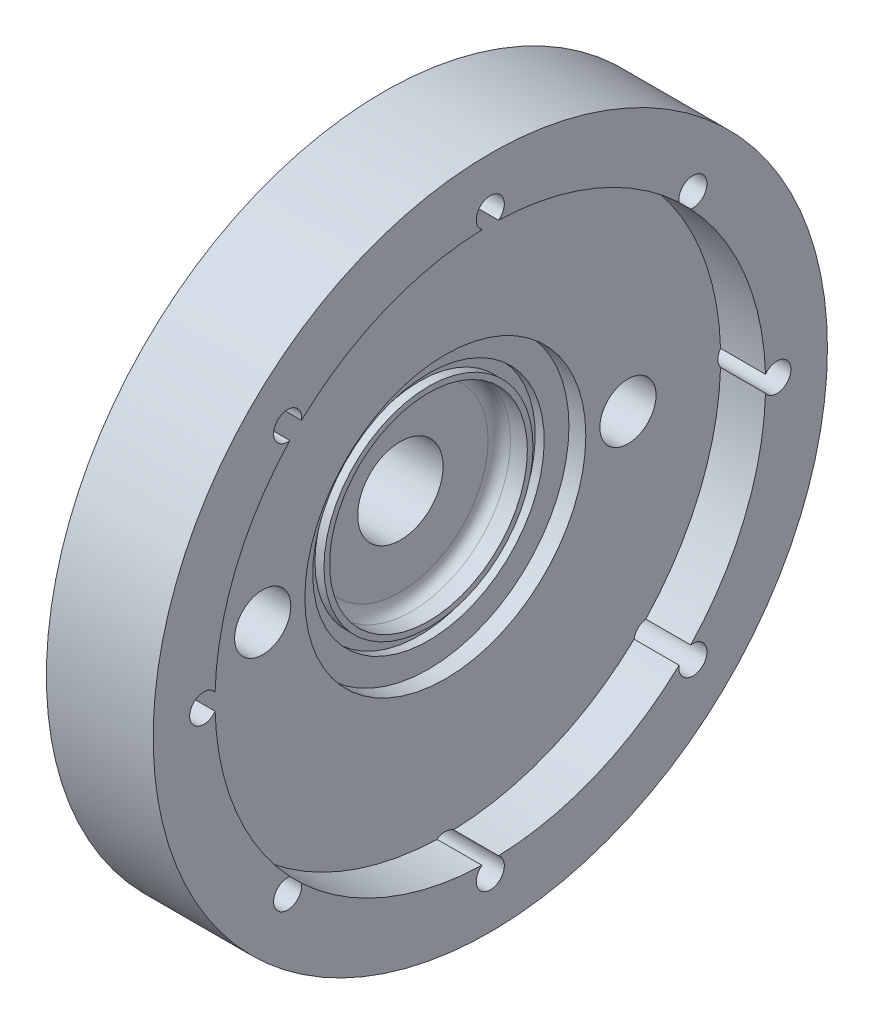
ISO-10303-21;
HEADER;
FILE_DESCRIPTION(('STEP AP214'),'2;1');
FILE_NAME('part.step','',(''),(''),'','','');
FILE_SCHEMA(('AUTOMOTIVE_DESIGN { 1 0 10303 214 1 1 1 1 }'));
ENDSEC;
DATA;
#1=APPLICATION_CONTEXT('core data for automotive mechanical design processes');
#2=APPLICATION_PROTOCOL_DEFINITION('international standard','automotive_design',2000,#1);
#3=PRODUCT_CONTEXT('',#1,'mechanical');
#4=PRODUCT('Part','Part','',(#3));
#5=PRODUCT_RELATED_PRODUCT_CATEGORY('part','',(#4));
#6=PRODUCT_DEFINITION_FORMATION('','',#4);
#7=PRODUCT_DEFINITION_CONTEXT('part definition',#1,'design');
#8=PRODUCT_DEFINITION('design','',#6,#7);
#9=PRODUCT_DEFINITION_SHAPE('','',#8);
#10=(LENGTH_UNIT() NAMED_UNIT(*) SI_UNIT(.MILLI.,.METRE.));
#11=(NAMED_UNIT(*) PLANE_ANGLE_UNIT() SI_UNIT($,.RADIAN.));
#12=(NAMED_UNIT(*) SI_UNIT($,.STERADIAN.) SOLID_ANGLE_UNIT());
#13=UNCERTAINTY_MEASURE_WITH_UNIT(LENGTH_MEASURE(1.E-05),#10,'distance_accuracy_value','');
#14=(GEOMETRIC_REPRESENTATION_CONTEXT(3) GLOBAL_UNCERTAINTY_ASSIGNED_CONTEXT((#13)) GLOBAL_UNIT_ASSIGNED_CONTEXT((#10,
#11,#12)) REPRESENTATION_CONTEXT('',''));
#15=CARTESIAN_POINT('',(0.,0.,0.));
#16=DIRECTION('',(0.,0.,1.));
#17=DIRECTION('',(1.,0.,0.));
#18=AXIS2_PLACEMENT_3D('',#15,#16,#17);
#19=CARTESIAN_POINT('',(13.97,0.,0.));
#20=DIRECTION('',(-1.,0.,0.));
#21=DIRECTION('',(0.,0.,1.));
#22=AXIS2_PLACEMENT_3D('',#19,#20,#21);
#23=CYLINDRICAL_SURFACE('',#22,62.23);
#24=DIRECTION('',(1.,0.,0.));
#25=VECTOR('',#24,1.);
#26=CARTESIAN_POINT('',(-8.89,62.2019852941176,-1.8670633278952));
#27=LINE('',#26,#25);
#28=CARTESIAN_POINT('',(3.81,62.2019852941176,-1.8670633278952));
#29=VERTEX_POINT('',#28);
#30=CARTESIAN_POINT('',(13.97,62.2019852941177,-1.86706332789523));
#31=VERTEX_POINT('',#30);
#32=EDGE_CURVE('E11',#29,#31,#27,.T.);
#33=ORIENTED_EDGE('',*,*,#32,.F.);
#34=CARTESIAN_POINT('',(3.81,0.,0.));
#35=DIRECTION('',(1.,0.,0.));
#36=DIRECTION('',(0.,0.,-1.));
#37=AXIS2_PLACEMENT_3D('',#34,#35,#36);
#38=CIRCLE('',#37,62.23);
#39=CARTESIAN_POINT('',(3.81,45.3036587447961,-42.6632324646768));
#40=VERTEX_POINT('',#39);
#41=EDGE_CURVE('E326',#29,#40,#38,.F.);
#42=ORIENTED_EDGE('',*,*,#41,.T.);
#43=DIRECTION('',(1.,0.,0.));
#44=VECTOR('',#43,1.);
#45=CARTESIAN_POINT('',(-8.89,45.3036587447961,-42.6632324646768));
#46=LINE('',#45,#44);
#47=CARTESIAN_POINT('',(13.97,45.3036587447962,-42.6632324646768));
#48=VERTEX_POINT('',#47);
#49=EDGE_CURVE('E160',#48,#40,#46,.F.);
#50=ORIENTED_EDGE('',*,*,#49,.F.);
#51=CARTESIAN_POINT('',(13.97,0.,0.));
#52=DIRECTION('',(1.,0.,0.));
#53=DIRECTION('',(0.,0.,-1.));
#54=AXIS2_PLACEMENT_3D('',#51,#52,#53);
#55=CIRCLE('',#54,62.23);
#56=EDGE_CURVE('E171',#48,#31,#55,.T.);
#57=ORIENTED_EDGE('',*,*,#56,.T.);
#58=EDGE_LOOP('',(#33,#42,#50,#57));
#59=FACE_BOUND('',#58,.T.);
#60=ADVANCED_FACE('F38',(#59),#23,.F.);
#61=DIRECTION('',(1.,0.,0.));
#62=VECTOR('',#61,1.);
#63=CARTESIAN_POINT('',(-8.89,62.2019852941176,1.86706332789564));
#64=LINE('',#63,#62);
#65=CARTESIAN_POINT('',(13.97,62.2019852941176,1.86706332789566));
#66=VERTEX_POINT('',#65);
#67=CARTESIAN_POINT('',(3.81,62.2019852941176,1.86706332789564));
#68=VERTEX_POINT('',#67);
#69=EDGE_CURVE('E46',#66,#68,#64,.F.);
#70=ORIENTED_EDGE('',*,*,#69,.F.);
#71=CARTESIAN_POINT('',(13.97,45.3036587447959,42.6632324646771));
#72=VERTEX_POINT('',#71);
#73=EDGE_CURVE('E184',#66,#72,#55,.T.);
#74=ORIENTED_EDGE('',*,*,#73,.T.);
#75=DIRECTION('',(1.,0.,0.));
#76=VECTOR('',#75,1.);
#77=CARTESIAN_POINT('',(-8.89,45.3036587447958,42.6632324646772));
#78=LINE('',#77,#76);
#79=CARTESIAN_POINT('',(3.81,45.3036587447958,42.6632324646772));
#80=VERTEX_POINT('',#79);
#81=EDGE_CURVE('E267',#80,#72,#78,.T.);
#82=ORIENTED_EDGE('',*,*,#81,.F.);
#83=EDGE_CURVE('E266',#80,#68,#38,.F.);
#84=ORIENTED_EDGE('',*,*,#83,.T.);
#85=EDGE_LOOP('',(#70,#74,#82,#84));
#86=FACE_BOUND('',#85,.T.);
#87=ADVANCED_FACE('F263',(#86),#23,.F.);
#88=DIRECTION('',(1.,0.,0.));
#89=VECTOR('',#88,1.);
#90=CARTESIAN_POINT('',(-8.89,42.6632324646767,45.3036587447963));
#91=LINE('',#90,#89);
#92=CARTESIAN_POINT('',(13.97,42.6632324646767,45.3036587447963));
#93=VERTEX_POINT('',#92);
#94=CARTESIAN_POINT('',(3.81,42.6632324646767,45.3036587447963));
#95=VERTEX_POINT('',#94);
#96=EDGE_CURVE('E314',#93,#95,#91,.F.);
#97=ORIENTED_EDGE('',*,*,#96,.F.);
#98=CARTESIAN_POINT('',(13.97,1.86706332789544,62.2019852941176));
#99=VERTEX_POINT('',#98);
#100=EDGE_CURVE('E270',#93,#99,#55,.T.);
#101=ORIENTED_EDGE('',*,*,#100,.T.);
#102=DIRECTION('',(1.,0.,0.));
#103=VECTOR('',#102,1.);
#104=CARTESIAN_POINT('',(-8.89,1.86706332789542,62.2019852941176));
#105=LINE('',#104,#103);
#106=CARTESIAN_POINT('',(3.81,1.86706332789541,62.2019852941176));
#107=VERTEX_POINT('',#106);
#108=EDGE_CURVE('E312',#107,#99,#105,.T.);
#109=ORIENTED_EDGE('',*,*,#108,.F.);
#110=EDGE_CURVE('E325',#107,#95,#38,.F.);
#111=ORIENTED_EDGE('',*,*,#110,.T.);
#112=EDGE_LOOP('',(#97,#101,#109,#111));
#113=FACE_BOUND('',#112,.T.);
#114=ADVANCED_FACE('F415',(#113),#23,.F.);
#115=DIRECTION('',(1.,0.,0.));
#116=VECTOR('',#115,1.);
#117=CARTESIAN_POINT('',(-8.89,-1.86706332789542,62.2019852941176));
#118=LINE('',#117,#116);
#119=CARTESIAN_POINT('',(13.97,-1.86706332789544,62.2019852941176));
#120=VERTEX_POINT('',#119);
#121=CARTESIAN_POINT('',(3.81,-1.86706332789546,62.2019852941176));
#122=VERTEX_POINT('',#121);
#123=EDGE_CURVE('E310',#120,#122,#118,.F.);
#124=ORIENTED_EDGE('',*,*,#123,.F.);
#125=CARTESIAN_POINT('',(13.97,-42.6632324646773,45.3036587447957));
#126=VERTEX_POINT('',#125);
#127=EDGE_CURVE('E272',#120,#126,#55,.T.);
#128=ORIENTED_EDGE('',*,*,#127,.T.);
#129=DIRECTION('',(1.,0.,0.));
#130=VECTOR('',#129,1.);
#131=CARTESIAN_POINT('',(-8.89,-42.6632324646773,45.3036587447957));
#132=LINE('',#131,#130);
#133=CARTESIAN_POINT('',(3.81,-42.6632324646773,45.3036587447957));
#134=VERTEX_POINT('',#133);
#135=EDGE_CURVE('E308',#134,#126,#132,.T.);
#136=ORIENTED_EDGE('',*,*,#135,.F.);
#137=EDGE_CURVE('E328',#134,#122,#38,.F.);
#138=ORIENTED_EDGE('',*,*,#137,.T.);
#139=EDGE_LOOP('',(#124,#128,#136,#138));
#140=FACE_BOUND('',#139,.T.);
#141=ADVANCED_FACE('F555',(#140),#23,.F.);
#142=DIRECTION('',(1.,0.,0.));
#143=VECTOR('',#142,1.);
#144=CARTESIAN_POINT('',(-8.89,-45.3036587447964,42.6632324646765));
#145=LINE('',#144,#143);
#146=CARTESIAN_POINT('',(13.97,-45.3036587447965,42.6632324646765));
#147=VERTEX_POINT('',#146);
#148=CARTESIAN_POINT('',(3.81,-45.3036587447964,42.6632324646765));
#149=VERTEX_POINT('',#148);
#150=EDGE_CURVE('E290',#147,#149,#145,.F.);
#151=ORIENTED_EDGE('',*,*,#150,.F.);
#152=CARTESIAN_POINT('',(13.97,-62.2019852941177,1.86706332789479));
#153=VERTEX_POINT('',#152);
#154=EDGE_CURVE('E193',#147,#153,#55,.T.);
#155=ORIENTED_EDGE('',*,*,#154,.T.);
#156=DIRECTION('',(1.,0.,0.));
#157=VECTOR('',#156,1.);
#158=CARTESIAN_POINT('',(-8.89,-62.2019852941177,1.86706332789477));
#159=LINE('',#158,#157);
#160=CARTESIAN_POINT('',(3.81,-62.2019852941177,1.86706332789476));
#161=VERTEX_POINT('',#160);
#162=EDGE_CURVE('E288',#161,#153,#159,.T.);
#163=ORIENTED_EDGE('',*,*,#162,.F.);
#164=EDGE_CURVE('E694',#161,#149,#38,.F.);
#165=ORIENTED_EDGE('',*,*,#164,.T.);
#166=EDGE_LOOP('',(#151,#155,#163,#165));
#167=FACE_BOUND('',#166,.T.);
#168=ADVANCED_FACE('F286',(#167),#23,.F.);
#169=DIRECTION('',(1.,0.,0.));
#170=VECTOR('',#169,1.);
#171=CARTESIAN_POINT('',(-8.89,-62.2019852941176,-1.86706332789607));
#172=LINE('',#171,#170);
#173=CARTESIAN_POINT('',(13.97,-62.2019852941176,-1.86706332789609));
#174=VERTEX_POINT('',#173);
#175=CARTESIAN_POINT('',(3.81,-62.2019852941176,-1.86706332789607));
#176=VERTEX_POINT('',#175);
#177=EDGE_CURVE('E299',#174,#176,#172,.F.);
#178=ORIENTED_EDGE('',*,*,#177,.F.);
#179=CARTESIAN_POINT('',(13.97,-45.3036587447956,-42.6632324646774));
#180=VERTEX_POINT('',#179);
#181=EDGE_CURVE('E186',#174,#180,#55,.T.);
#182=ORIENTED_EDGE('',*,*,#181,.T.);
#183=DIRECTION('',(1.,0.,0.));
#184=VECTOR('',#183,1.);
#185=CARTESIAN_POINT('',(-8.89,-45.3036587447955,-42.6632324646775));
#186=LINE('',#185,#184);
#187=CARTESIAN_POINT('',(3.81,-45.3036587447955,-42.6632324646775));
#188=VERTEX_POINT('',#187);
#189=EDGE_CURVE('E297',#188,#180,#186,.T.);
#190=ORIENTED_EDGE('',*,*,#189,.F.);
#191=EDGE_CURVE('E300',#188,#176,#38,.F.);
#192=ORIENTED_EDGE('',*,*,#191,.T.);
#193=EDGE_LOOP('',(#178,#182,#190,#192));
#194=FACE_BOUND('',#193,.T.);
#195=ADVANCED_FACE('F295',(#194),#23,.F.);
#196=DIRECTION('',(1.,0.,0.));
#197=VECTOR('',#196,1.);
#198=CARTESIAN_POINT('',(-8.89,42.663232464677,-45.303658744796));
#199=LINE('',#198,#197);
#200=CARTESIAN_POINT('',(3.81,42.663232464677,-45.303658744796));
#201=VERTEX_POINT('',#200);
#202=CARTESIAN_POINT('',(13.97,42.663232464677,-45.303658744796));
#203=VERTEX_POINT('',#202);
#204=EDGE_CURVE('E149',#201,#203,#199,.T.);
#205=ORIENTED_EDGE('',*,*,#204,.F.);
#206=CARTESIAN_POINT('',(3.81,1.86706332789543,-62.2019852941176));
#207=VERTEX_POINT('',#206);
#208=EDGE_CURVE('E330',#201,#207,#38,.F.);
#209=ORIENTED_EDGE('',*,*,#208,.T.);
#210=DIRECTION('',(1.,0.,0.));
#211=VECTOR('',#210,1.);
#212=CARTESIAN_POINT('',(-8.89,1.86706332789542,-62.2019852941176));
#213=LINE('',#212,#211);
#214=CARTESIAN_POINT('',(13.97,1.86706332789544,-62.2019852941176));
#215=VERTEX_POINT('',#214);
#216=EDGE_CURVE('E177',#215,#207,#213,.F.);
#217=ORIENTED_EDGE('',*,*,#216,.F.);
#218=EDGE_CURVE('E169',#215,#203,#55,.T.);
#219=ORIENTED_EDGE('',*,*,#218,.T.);
#220=EDGE_LOOP('',(#205,#209,#217,#219));
#221=FACE_BOUND('',#220,.T.);
#222=ADVANCED_FACE('F175',(#221),#23,.F.);
#223=CARTESIAN_POINT('',(3.81,0.,0.));
#224=DIRECTION('',(1.,0.,0.));
#225=DIRECTION('',(0.,0.,-1.));
#226=AXIS2_PLACEMENT_3D('',#223,#224,#225);
#227=PLANE('',#226);
#228=CARTESIAN_POINT('',(3.81,64.77,2.2614324631687E-13));
#229=DIRECTION('',(1.,0.,0.));
#230=DIRECTION('',(0.,0.,-1.));
#231=AXIS2_PLACEMENT_3D('',#228,#229,#230);
#232=CIRCLE('',#231,3.175);
#233=EDGE_CURVE('E215',#68,#29,#232,.T.);
#234=ORIENTED_EDGE('',*,*,#233,.F.);
#235=ORIENTED_EDGE('',*,*,#83,.F.);
#236=CARTESIAN_POINT('',(3.81,45.7993062174524,45.7993062174529));
#237=DIRECTION('',(1.,0.,0.));
#238=DIRECTION('',(0.,0.,-1.));
#239=AXIS2_PLACEMENT_3D('',#236,#237,#238);
#240=CIRCLE('',#239,3.175);
#241=EDGE_CURVE('E220',#95,#80,#240,.T.);
#242=ORIENTED_EDGE('',*,*,#241,.F.);
#243=ORIENTED_EDGE('',*,*,#110,.F.);
#244=CARTESIAN_POINT('',(3.81,0.,64.77));
#245=DIRECTION('',(1.,0.,0.));
#246=DIRECTION('',(0.,0.,-1.));
#247=AXIS2_PLACEMENT_3D('',#244,#245,#246);
#248=CIRCLE('',#247,3.175);
#249=EDGE_CURVE('E225',#122,#107,#248,.T.);
#250=ORIENTED_EDGE('',*,*,#249,.F.);
#251=ORIENTED_EDGE('',*,*,#137,.F.);
#252=CARTESIAN_POINT('',(3.81,-45.7993062174531,45.7993062174523));
#253=DIRECTION('',(1.,0.,0.));
#254=DIRECTION('',(0.,0.,-1.));
#255=AXIS2_PLACEMENT_3D('',#252,#253,#254);
#256=CIRCLE('',#255,3.175);
#257=EDGE_CURVE('E230',#149,#134,#256,.T.);
#258=ORIENTED_EDGE('',*,*,#257,.F.);
#259=ORIENTED_EDGE('',*,*,#164,.F.);
#260=CARTESIAN_POINT('',(3.81,-64.77,-6.78429738950609E-13));
#261=DIRECTION('',(1.,0.,0.));
#262=DIRECTION('',(0.,0.,-1.));
#263=AXIS2_PLACEMENT_3D('',#260,#261,#262);
#264=CIRCLE('',#263,3.175);
#265=EDGE_CURVE('E235',#176,#161,#264,.T.);
#266=ORIENTED_EDGE('',*,*,#265,.F.);
#267=ORIENTED_EDGE('',*,*,#191,.F.);
#268=CARTESIAN_POINT('',(3.81,-45.7993062174521,-45.7993062174532));
#269=DIRECTION('',(1.,0.,0.));
#270=DIRECTION('',(0.,0.,-1.));
#271=AXIS2_PLACEMENT_3D('',#268,#269,#270);
#272=CIRCLE('',#271,3.175);
#273=CARTESIAN_POINT('',(3.81,-42.6632324646763,-45.3036587447966));
#274=VERTEX_POINT('',#273);
#275=EDGE_CURVE('E240',#274,#188,#272,.T.);
#276=ORIENTED_EDGE('',*,*,#275,.F.);
#277=CARTESIAN_POINT('',(3.81,-1.86706332789541,-62.2019852941176));
#278=VERTEX_POINT('',#277);
#279=EDGE_CURVE('E331',#278,#274,#38,.F.);
#280=ORIENTED_EDGE('',*,*,#279,.F.);
#281=CARTESIAN_POINT('',(3.81,0.,-64.77));
#282=DIRECTION('',(1.,0.,0.));
#283=DIRECTION('',(0.,0.,-1.));
#284=AXIS2_PLACEMENT_3D('',#281,#282,#283);
#285=CIRCLE('',#284,3.175);
#286=EDGE_CURVE('E208',#207,#278,#285,.T.);
#287=ORIENTED_EDGE('',*,*,#286,.F.);
#288=ORIENTED_EDGE('',*,*,#208,.F.);
#289=CARTESIAN_POINT('',(3.81,45.7993062174528,-45.7993062174526));
#290=DIRECTION('',(1.,0.,0.));
#291=DIRECTION('',(0.,0.,-1.));
#292=AXIS2_PLACEMENT_3D('',#289,#290,#291);
#293=CIRCLE('',#292,3.175);
#294=EDGE_CURVE('E155',#40,#201,#293,.T.);
#295=ORIENTED_EDGE('',*,*,#294,.F.);
#296=ORIENTED_EDGE('',*,*,#41,.F.);
#297=EDGE_LOOP('',(#234,#235,#242,#243,#250,#251,#258,#259,#266,#267,#276,#280,#287,#288,#295,#296));
#298=FACE_BOUND('',#297,.T.);
#299=CARTESIAN_POINT('',(3.81,0.,-41.275));
#300=DIRECTION('',(1.,0.,0.));
#301=DIRECTION('',(0.,0.,-1.));
#302=AXIS2_PLACEMENT_3D('',#299,#300,#301);
#303=CIRCLE('',#302,6.35);
#304=CARTESIAN_POINT('',(3.81,0.,-47.625));
#305=VERTEX_POINT('',#304);
#306=EDGE_CURVE('E187',#305,#305,#303,.T.);
#307=ORIENTED_EDGE('',*,*,#306,.F.);
#308=EDGE_LOOP('',(#307));
#309=FACE_BOUND('',#308,.T.);
#310=CARTESIAN_POINT('',(3.81,0.,41.275));
#311=DIRECTION('',(1.,0.,0.));
#312=DIRECTION('',(0.,0.,-1.));
#313=AXIS2_PLACEMENT_3D('',#310,#311,#312);
#314=CIRCLE('',#313,6.35);
#315=CARTESIAN_POINT('',(3.81,0.,34.925));
#316=VERTEX_POINT('',#315);
#317=EDGE_CURVE('E199',#316,#316,#314,.T.);
#318=ORIENTED_EDGE('',*,*,#317,.F.);
#319=EDGE_LOOP('',(#318));
#320=FACE_BOUND('',#319,.T.);
#321=CARTESIAN_POINT('',(3.81,0.,0.));
#322=DIRECTION('',(1.,0.,0.));
#323=DIRECTION('',(0.,0.,-1.));
#324=AXIS2_PLACEMENT_3D('',#321,#322,#323);
#325=CIRCLE('',#324,31.75);
#326=CARTESIAN_POINT('',(3.81,0.,31.75));
#327=VERTEX_POINT('',#326);
#328=EDGE_CURVE('E390',#327,#327,#325,.T.);
#329=ORIENTED_EDGE('',*,*,#328,.F.);
#330=EDGE_LOOP('',(#329));
#331=FACE_BOUND('',#330,.T.);
#332=ADVANCED_FACE('F320',(#298,#309,#320,#331),#227,.T.);
#333=CARTESIAN_POINT('',(0.,22.352,0.));
#334=DIRECTION('',(1.,0.,0.));
#335=DIRECTION('',(0.,0.,-1.));
#336=AXIS2_PLACEMENT_3D('',#333,#334,#335);
#337=PLANE('',#336);
#338=CARTESIAN_POINT('',(0.,0.,0.));
#339=DIRECTION('',(1.,0.,0.));
#340=DIRECTION('',(0.,1.,0.));
#341=AXIS2_PLACEMENT_3D('',#338,#339,#340);
#342=CIRCLE('',#341,26.162);
#343=CARTESIAN_POINT('',(0.,26.162,0.));
#344=VERTEX_POINT('',#343);
#345=EDGE_CURVE('E378',#344,#344,#342,.T.);
#346=ORIENTED_EDGE('',*,*,#345,.F.);
#347=EDGE_LOOP('',(#346));
#348=FACE_BOUND('',#347,.T.);
#349=CARTESIAN_POINT('',(0.,0.,0.));
#350=DIRECTION('',(1.,0.,0.));
#351=DIRECTION('',(0.,0.,-1.));
#352=AXIS2_PLACEMENT_3D('',#349,#350,#351);
#353=CIRCLE('',#352,31.75);
#354=CARTESIAN_POINT('',(0.,0.,31.75));
#355=VERTEX_POINT('',#354);
#356=EDGE_CURVE('E182',#355,#355,#353,.T.);
#357=ORIENTED_EDGE('',*,*,#356,.T.);
#358=EDGE_LOOP('',(#357));
#359=FACE_BOUND('',#358,.T.);
#360=ADVANCED_FACE('F40',(#348,#359),#337,.T.);
#361=CARTESIAN_POINT('',(0.,0.,0.));
#362=DIRECTION('',(1.,0.,0.));
#363=DIRECTION('',(0.,0.,-1.));
#364=AXIS2_PLACEMENT_3D('',#361,#362,#363);
#365=CIRCLE('',#364,22.352);
#366=CARTESIAN_POINT('',(0.,0.,-22.352));
#367=VERTEX_POINT('',#366);
#368=EDGE_CURVE('E335',#367,#367,#365,.T.);
#369=ORIENTED_EDGE('',*,*,#368,.F.);
#370=EDGE_LOOP('',(#369));
#371=FACE_BOUND('',#370,.T.);
#372=CARTESIAN_POINT('',(0.,0.,0.));
#373=DIRECTION('',(1.,0.,0.));
#374=DIRECTION('',(0.,1.,0.));
#375=AXIS2_PLACEMENT_3D('',#372,#373,#374);
#376=CIRCLE('',#375,23.622);
#377=CARTESIAN_POINT('',(0.,23.622,0.));
#378=VERTEX_POINT('',#377);
#379=EDGE_CURVE('E387',#378,#378,#376,.T.);
#380=ORIENTED_EDGE('',*,*,#379,.T.);
#381=EDGE_LOOP('',(#380));
#382=FACE_BOUND('',#381,.T.);
#383=ADVANCED_FACE('F405',(#371,#382),#337,.T.);
#384=CARTESIAN_POINT('',(0.,0.,0.));
#385=DIRECTION('',(1.,0.,0.));
#386=DIRECTION('',(0.,0.,-1.));
#387=AXIS2_PLACEMENT_3D('',#384,#385,#386);
#388=CYLINDRICAL_SURFACE('',#387,22.352);
#389=ORIENTED_EDGE('',*,*,#368,.T.);
#390=EDGE_LOOP('',(#389));
#391=FACE_BOUND('',#390,.T.);
#392=CARTESIAN_POINT('',(-3.81,0.,0.));
#393=DIRECTION('',(1.,0.,0.));
#394=DIRECTION('',(0.,0.,-1.));
#395=AXIS2_PLACEMENT_3D('',#392,#393,#394);
#396=CIRCLE('',#395,22.352);
#397=CARTESIAN_POINT('',(-3.81,0.,-22.352));
#398=VERTEX_POINT('',#397);
#399=EDGE_CURVE('E350',#398,#398,#396,.T.);
#400=ORIENTED_EDGE('',*,*,#399,.F.);
#401=EDGE_LOOP('',(#400));
#402=FACE_BOUND('',#401,.T.);
#403=ADVANCED_FACE('F477',(#391,#402),#388,.F.);
#404=CARTESIAN_POINT('',(-3.81,0.,0.));
#405=DIRECTION('',(1.,0.,0.));
#406=DIRECTION('',(0.,0.,-1.));
#407=AXIS2_PLACEMENT_3D('',#404,#405,#406);
#408=TOROIDAL_SURFACE('',#407,19.812,2.54);
#409=ORIENTED_EDGE('',*,*,#399,.T.);
#410=EDGE_LOOP('',(#409));
#411=FACE_BOUND('',#410,.T.);
#412=CARTESIAN_POINT('',(-6.35,0.,0.));
#413=DIRECTION('',(1.,0.,0.));
#414=DIRECTION('',(0.,0.,-1.));
#415=AXIS2_PLACEMENT_3D('',#412,#413,#414);
#416=CIRCLE('',#415,19.812);
#417=CARTESIAN_POINT('',(-6.35,0.,-19.812));
#418=VERTEX_POINT('',#417);
#419=EDGE_CURVE('E354',#418,#418,#416,.T.);
#420=ORIENTED_EDGE('',*,*,#419,.F.);
#421=EDGE_LOOP('',(#420));
#422=FACE_BOUND('',#421,.T.);
#423=ADVANCED_FACE('F474',(#411,#422),#408,.F.);
#424=CARTESIAN_POINT('',(-6.35,9.652,0.));
#425=DIRECTION('',(1.,0.,0.));
#426=DIRECTION('',(0.,0.,-1.));
#427=AXIS2_PLACEMENT_3D('',#424,#425,#426);
#428=PLANE('',#427);
#429=ORIENTED_EDGE('',*,*,#419,.T.);
#430=EDGE_LOOP('',(#429));
#431=FACE_BOUND('',#430,.T.);
#432=CARTESIAN_POINT('',(-6.35,0.,0.));
#433=DIRECTION('',(1.,0.,0.));
#434=DIRECTION('',(0.,0.,-1.));
#435=AXIS2_PLACEMENT_3D('',#432,#433,#434);
#436=CIRCLE('',#435,9.652);
#437=CARTESIAN_POINT('',(-6.35,0.,-9.652));
#438=VERTEX_POINT('',#437);
#439=EDGE_CURVE('E358',#438,#438,#436,.T.);
#440=ORIENTED_EDGE('',*,*,#439,.F.);
#441=EDGE_LOOP('',(#440));
#442=FACE_BOUND('',#441,.T.);
#443=ADVANCED_FACE('F470',(#431,#442),#428,.T.);
#444=CARTESIAN_POINT('',(0.,0.,0.));
#445=DIRECTION('',(1.,0.,0.));
#446=DIRECTION('',(0.,0.,-1.));
#447=AXIS2_PLACEMENT_3D('',#444,#445,#446);
#448=CYLINDRICAL_SURFACE('',#447,9.652);
#449=ORIENTED_EDGE('',*,*,#439,.T.);
#450=EDGE_LOOP('',(#449));
#451=FACE_BOUND('',#450,.T.);
#452=CARTESIAN_POINT('',(-31.75,0.,0.));
#453=DIRECTION('',(1.,0.,0.));
#454=DIRECTION('',(0.,0.,-1.));
#455=AXIS2_PLACEMENT_3D('',#452,#453,#454);
#456=CIRCLE('',#455,9.652);
#457=CARTESIAN_POINT('',(-31.75,0.,-9.652));
#458=VERTEX_POINT('',#457);
#459=EDGE_CURVE('E363',#458,#458,#456,.T.);
#460=ORIENTED_EDGE('',*,*,#459,.F.);
#461=EDGE_LOOP('',(#460));
#462=FACE_BOUND('',#461,.T.);
#463=ADVANCED_FACE('F466',(#451,#462),#448,.F.);
#464=CARTESIAN_POINT('',(-31.75,16.002,0.));
#465=DIRECTION('',(-1.,0.,0.));
#466=DIRECTION('',(0.,0.,1.));
#467=AXIS2_PLACEMENT_3D('',#464,#465,#466);
#468=PLANE('',#467);
#469=ORIENTED_EDGE('',*,*,#459,.T.);
#470=EDGE_LOOP('',(#469));
#471=FACE_BOUND('',#470,.T.);
#472=CARTESIAN_POINT('',(-31.75,0.,0.));
#473=DIRECTION('',(1.,0.,0.));
#474=DIRECTION('',(0.,0.,-1.));
#475=AXIS2_PLACEMENT_3D('',#472,#473,#474);
#476=CIRCLE('',#475,16.002);
#477=CARTESIAN_POINT('',(-31.75,0.,-16.002));
#478=VERTEX_POINT('',#477);
#479=EDGE_CURVE('E366',#478,#478,#476,.T.);
#480=ORIENTED_EDGE('',*,*,#479,.F.);
#481=EDGE_LOOP('',(#480));
#482=FACE_BOUND('',#481,.T.);
#483=ADVANCED_FACE('F462',(#471,#482),#468,.T.);
#484=CARTESIAN_POINT('',(0.,0.,0.));
#485=DIRECTION('',(1.,0.,0.));
#486=DIRECTION('',(0.,0.,-1.));
#487=AXIS2_PLACEMENT_3D('',#484,#485,#486);
#488=CYLINDRICAL_SURFACE('',#487,16.002);
#489=ORIENTED_EDGE('',*,*,#479,.T.);
#490=EDGE_LOOP('',(#489));
#491=FACE_BOUND('',#490,.T.);
#492=CARTESIAN_POINT('',(-15.24,0.,0.));
#493=DIRECTION('',(1.,0.,0.));
#494=DIRECTION('',(0.,0.,-1.));
#495=AXIS2_PLACEMENT_3D('',#492,#493,#494);
#496=CIRCLE('',#495,16.002);
#497=CARTESIAN_POINT('',(-15.24,0.,-16.002));
#498=VERTEX_POINT('',#497);
#499=EDGE_CURVE('E369',#498,#498,#496,.T.);
#500=ORIENTED_EDGE('',*,*,#499,.F.);
#501=EDGE_LOOP('',(#500));
#502=FACE_BOUND('',#501,.T.);
#503=ADVANCED_FACE('F458',(#491,#502),#488,.T.);
#504=CARTESIAN_POINT('',(-15.24,0.,0.));
#505=DIRECTION('',(1.,0.,0.));
#506=DIRECTION('',(0.,0.,-1.));
#507=AXIS2_PLACEMENT_3D('',#504,#505,#506);
#508=TOROIDAL_SURFACE('',#507,21.082,5.08);
#509=ORIENTED_EDGE('',*,*,#499,.T.);
#510=EDGE_LOOP('',(#509));
#511=FACE_BOUND('',#510,.T.);
#512=CARTESIAN_POINT('',(-10.16,0.,0.));
#513=DIRECTION('',(1.,0.,0.));
#514=DIRECTION('',(0.,0.,-1.));
#515=AXIS2_PLACEMENT_3D('',#512,#513,#514);
#516=CIRCLE('',#515,21.082);
#517=CARTESIAN_POINT('',(-10.16,0.,-21.082));
#518=VERTEX_POINT('',#517);
#519=EDGE_CURVE('E372',#518,#518,#516,.T.);
#520=ORIENTED_EDGE('',*,*,#519,.F.);
#521=EDGE_LOOP('',(#520));
#522=FACE_BOUND('',#521,.T.);
#523=ADVANCED_FACE('F454',(#511,#522),#508,.F.);
#524=CARTESIAN_POINT('',(-10.16,76.2,0.));
#525=DIRECTION('',(-1.,0.,0.));
#526=DIRECTION('',(0.,0.,1.));
#527=AXIS2_PLACEMENT_3D('',#524,#525,#526);
#528=PLANE('',#527);
#529=CARTESIAN_POINT('',(-10.16,64.77,2.2614324631687E-13));
#530=DIRECTION('',(-1.,0.,0.));
#531=DIRECTION('',(0.,0.,1.));
#532=AXIS2_PLACEMENT_3D('',#529,#530,#531);
#533=CIRCLE('',#532,3.175);
#534=CARTESIAN_POINT('',(-10.16,64.77,3.17500000000022));
#535=VERTEX_POINT('',#534);
#536=EDGE_CURVE('E212',#535,#535,#533,.T.);
#537=ORIENTED_EDGE('',*,*,#536,.F.);
#538=EDGE_LOOP('',(#537));
#539=FACE_BOUND('',#538,.T.);
#540=CARTESIAN_POINT('',(-10.16,45.7993062174524,45.7993062174529));
#541=DIRECTION('',(-1.,0.,0.));
#542=DIRECTION('',(0.,0.,1.));
#543=AXIS2_PLACEMENT_3D('',#540,#541,#542);
#544=CIRCLE('',#543,3.175);
#545=CARTESIAN_POINT('',(-10.16,45.7993062174524,48.9743062174529));
#546=VERTEX_POINT('',#545);
#547=EDGE_CURVE('E217',#546,#546,#544,.T.);
#548=ORIENTED_EDGE('',*,*,#547,.F.);
#549=EDGE_LOOP('',(#548));
#550=FACE_BOUND('',#549,.T.);
#551=CARTESIAN_POINT('',(-10.16,0.,64.77));
#552=DIRECTION('',(-1.,0.,0.));
#553=DIRECTION('',(0.,0.,1.));
#554=AXIS2_PLACEMENT_3D('',#551,#552,#553);
#555=CIRCLE('',#554,3.175);
#556=CARTESIAN_POINT('',(-10.16,0.,67.945));
#557=VERTEX_POINT('',#556);
#558=EDGE_CURVE('E222',#557,#557,#555,.T.);
#559=ORIENTED_EDGE('',*,*,#558,.F.);
#560=EDGE_LOOP('',(#559));
#561=FACE_BOUND('',#560,.T.);
#562=CARTESIAN_POINT('',(-10.16,-45.7993062174531,45.7993062174523));
#563=DIRECTION('',(-1.,0.,0.));
#564=DIRECTION('',(0.,0.,1.));
#565=AXIS2_PLACEMENT_3D('',#562,#563,#564);
#566=CIRCLE('',#565,3.175);
#567=CARTESIAN_POINT('',(-10.16,-45.7993062174531,48.9743062174523));
#568=VERTEX_POINT('',#567);
#569=EDGE_CURVE('E227',#568,#568,#566,.T.);
#570=ORIENTED_EDGE('',*,*,#569,.F.);
#571=EDGE_LOOP('',(#570));
#572=FACE_BOUND('',#571,.T.);
#573=CARTESIAN_POINT('',(-10.16,-64.77,-6.78429738950609E-13));
#574=DIRECTION('',(-1.,0.,0.));
#575=DIRECTION('',(0.,0.,1.));
#576=AXIS2_PLACEMENT_3D('',#573,#574,#575);
#577=CIRCLE('',#576,3.175);
#578=CARTESIAN_POINT('',(-10.16,-64.77,3.17499999999932));
#579=VERTEX_POINT('',#578);
#580=EDGE_CURVE('E232',#579,#579,#577,.T.);
#581=ORIENTED_EDGE('',*,*,#580,.F.);
#582=EDGE_LOOP('',(#581));
#583=FACE_BOUND('',#582,.T.);
#584=CARTESIAN_POINT('',(-10.16,-45.7993062174521,-45.7993062174532));
#585=DIRECTION('',(-1.,0.,0.));
#586=DIRECTION('',(0.,0.,1.));
#587=AXIS2_PLACEMENT_3D('',#584,#585,#586);
#588=CIRCLE('',#587,3.175);
#589=CARTESIAN_POINT('',(-10.16,-45.7993062174521,-42.6243062174532));
#590=VERTEX_POINT('',#589);
#591=EDGE_CURVE('E237',#590,#590,#588,.T.);
#592=ORIENTED_EDGE('',*,*,#591,.F.);
#593=EDGE_LOOP('',(#592));
#594=FACE_BOUND('',#593,.T.);
#595=CARTESIAN_POINT('',(-10.16,45.7993062174528,-45.7993062174526));
#596=DIRECTION('',(-1.,0.,0.));
#597=DIRECTION('',(0.,0.,1.));
#598=AXIS2_PLACEMENT_3D('',#595,#596,#597);
#599=CIRCLE('',#598,3.175);
#600=CARTESIAN_POINT('',(-10.16,45.7993062174528,-42.6243062174526));
#601=VERTEX_POINT('',#600);
#602=EDGE_CURVE('E242',#601,#601,#599,.T.);
#603=ORIENTED_EDGE('',*,*,#602,.F.);
#604=EDGE_LOOP('',(#603));
#605=FACE_BOUND('',#604,.T.);
#606=CARTESIAN_POINT('',(-10.16,0.,-64.77));
#607=DIRECTION('',(-1.,0.,0.));
#608=DIRECTION('',(0.,0.,1.));
#609=AXIS2_PLACEMENT_3D('',#606,#607,#608);
#610=CIRCLE('',#609,3.175);
#611=CARTESIAN_POINT('',(-10.16,0.,-61.595));
#612=VERTEX_POINT('',#611);
#613=EDGE_CURVE('E205',#612,#612,#610,.T.);
#614=ORIENTED_EDGE('',*,*,#613,.F.);
#615=EDGE_LOOP('',(#614));
#616=FACE_BOUND('',#615,.T.);
#617=CARTESIAN_POINT('',(-10.16,0.,-41.275));
#618=DIRECTION('',(-1.,0.,0.));
#619=DIRECTION('',(0.,0.,1.));
#620=AXIS2_PLACEMENT_3D('',#617,#618,#619);
#621=CIRCLE('',#620,6.35);
#622=CARTESIAN_POINT('',(-10.16,0.,-34.925));
#623=VERTEX_POINT('',#622);
#624=EDGE_CURVE('E195',#623,#623,#621,.T.);
#625=ORIENTED_EDGE('',*,*,#624,.F.);
#626=EDGE_LOOP('',(#625));
#627=FACE_BOUND('',#626,.T.);
#628=CARTESIAN_POINT('',(-10.16,0.,41.275));
#629=DIRECTION('',(-1.,0.,0.));
#630=DIRECTION('',(0.,0.,1.));
#631=AXIS2_PLACEMENT_3D('',#628,#629,#630);
#632=CIRCLE('',#631,6.35);
#633=CARTESIAN_POINT('',(-10.16,0.,47.625));
#634=VERTEX_POINT('',#633);
#635=EDGE_CURVE('E204',#634,#634,#632,.T.);
#636=ORIENTED_EDGE('',*,*,#635,.F.);
#637=EDGE_LOOP('',(#636));
#638=FACE_BOUND('',#637,.T.);
#639=ORIENTED_EDGE('',*,*,#519,.T.);
#640=EDGE_LOOP('',(#639));
#641=FACE_BOUND('',#640,.T.);
#642=CARTESIAN_POINT('',(-10.16,0.,0.));
#643=DIRECTION('',(1.,0.,0.));
#644=DIRECTION('',(0.,0.,-1.));
#645=AXIS2_PLACEMENT_3D('',#642,#643,#644);
#646=CIRCLE('',#645,76.2);
#647=CARTESIAN_POINT('',(-10.16,0.,-76.2));
#648=VERTEX_POINT('',#647);
#649=EDGE_CURVE('E375',#648,#648,#646,.T.);
#650=ORIENTED_EDGE('',*,*,#649,.F.);
#651=EDGE_LOOP('',(#650));
#652=FACE_BOUND('',#651,.T.);
#653=ADVANCED_FACE('F450',(#539,#550,#561,#572,#583,#594,#605,#616,#627,#638,#641,#652),#528,.T.);
#654=CARTESIAN_POINT('',(0.,0.,0.));
#655=DIRECTION('',(1.,0.,0.));
#656=DIRECTION('',(0.,0.,-1.));
#657=AXIS2_PLACEMENT_3D('',#654,#655,#656);
#658=CYLINDRICAL_SURFACE('',#657,76.2);
#659=ORIENTED_EDGE('',*,*,#649,.T.);
#660=EDGE_LOOP('',(#659));
#661=FACE_BOUND('',#660,.T.);
#662=CARTESIAN_POINT('',(13.97,0.,0.));
#663=DIRECTION('',(1.,0.,0.));
#664=DIRECTION('',(0.,0.,-1.));
#665=AXIS2_PLACEMENT_3D('',#662,#663,#664);
#666=CIRCLE('',#665,76.2);
#667=CARTESIAN_POINT('',(13.97,0.,-76.2));
#668=VERTEX_POINT('',#667);
#669=EDGE_CURVE('E178',#668,#668,#666,.T.);
#670=ORIENTED_EDGE('',*,*,#669,.F.);
#671=EDGE_LOOP('',(#670));
#672=FACE_BOUND('',#671,.T.);
#673=ADVANCED_FACE('F446',(#661,#672),#658,.T.);
#674=CARTESIAN_POINT('',(0.,0.,0.));
#675=DIRECTION('',(1.,0.,0.));
#676=DIRECTION('',(0.,1.,0.));
#677=AXIS2_PLACEMENT_3D('',#674,#675,#676);
#678=CYLINDRICAL_SURFACE('',#677,26.162);
#679=CARTESIAN_POINT('',(-2.03200000000002,0.,0.));
#680=DIRECTION('',(1.,0.,0.));
#681=DIRECTION('',(0.,1.,0.));
#682=AXIS2_PLACEMENT_3D('',#679,#680,#681);
#683=CIRCLE('',#682,26.162);
#684=CARTESIAN_POINT('',(-2.032,26.162,0.));
#685=VERTEX_POINT('',#684);
#686=EDGE_CURVE('E381',#685,#685,#683,.T.);
#687=ORIENTED_EDGE('',*,*,#686,.F.);
#688=EDGE_LOOP('',(#687));
#689=FACE_BOUND('',#688,.T.);
#690=ORIENTED_EDGE('',*,*,#345,.T.);
#691=EDGE_LOOP('',(#690));
#692=FACE_BOUND('',#691,.T.);
#693=ADVANCED_FACE('F438',(#689,#692),#678,.F.);
#694=CARTESIAN_POINT('',(-2.032,23.622,0.));
#695=DIRECTION('',(-1.,0.,0.));
#696=DIRECTION('',(0.,-1.,0.));
#697=AXIS2_PLACEMENT_3D('',#694,#695,#696);
#698=PLANE('',#697);
#699=CARTESIAN_POINT('',(-2.03200000000002,0.,0.));
#700=DIRECTION('',(1.,0.,0.));
#701=DIRECTION('',(0.,1.,0.));
#702=AXIS2_PLACEMENT_3D('',#699,#700,#701);
#703=CIRCLE('',#702,23.622);
#704=CARTESIAN_POINT('',(-2.032,23.622,0.));
#705=VERTEX_POINT('',#704);
#706=EDGE_CURVE('E384',#705,#705,#703,.T.);
#707=ORIENTED_EDGE('',*,*,#706,.F.);
#708=EDGE_LOOP('',(#707));
#709=FACE_BOUND('',#708,.T.);
#710=ORIENTED_EDGE('',*,*,#686,.T.);
#711=EDGE_LOOP('',(#710));
#712=FACE_BOUND('',#711,.T.);
#713=ADVANCED_FACE('F433',(#709,#712),#698,.F.);
#714=CARTESIAN_POINT('',(0.,0.,0.));
#715=DIRECTION('',(1.,0.,0.));
#716=DIRECTION('',(0.,1.,0.));
#717=AXIS2_PLACEMENT_3D('',#714,#715,#716);
#718=CYLINDRICAL_SURFACE('',#717,23.622);
#719=ORIENTED_EDGE('',*,*,#379,.F.);
#720=EDGE_LOOP('',(#719));
#721=FACE_BOUND('',#720,.T.);
#722=ORIENTED_EDGE('',*,*,#706,.T.);
#723=EDGE_LOOP('',(#722));
#724=FACE_BOUND('',#723,.T.);
#725=ADVANCED_FACE('F429',(#721,#724),#718,.T.);
#726=CARTESIAN_POINT('',(3.81,0.,0.));
#727=DIRECTION('',(-1.,0.,0.));
#728=DIRECTION('',(0.,0.,1.));
#729=AXIS2_PLACEMENT_3D('',#726,#727,#728);
#730=CYLINDRICAL_SURFACE('',#729,31.75);
#731=CARTESIAN_POINT('',(3.81,0.,31.75));
#732=CARTESIAN_POINT('',(3.7703125,0.,31.75));
#733=CARTESIAN_POINT('',(3.730625,0.,31.75));
#734=CARTESIAN_POINT('',(3.65125,0.,31.75));
#735=CARTESIAN_POINT('',(3.6115625,0.,31.75));
#736=CARTESIAN_POINT('',(3.5321875,0.,31.75));
#737=CARTESIAN_POINT('',(3.4925,0.,31.75));
#738=CARTESIAN_POINT('',(3.413125,0.,31.75));
#739=CARTESIAN_POINT('',(3.3734375,0.,31.75));
#740=CARTESIAN_POINT('',(3.2940625,0.,31.75));
#741=CARTESIAN_POINT('',(3.254375,0.,31.75));
#742=CARTESIAN_POINT('',(3.175,0.,31.75));
#743=CARTESIAN_POINT('',(3.1353125,0.,31.75));
#744=CARTESIAN_POINT('',(3.0559375,0.,31.75));
#745=CARTESIAN_POINT('',(3.01625,0.,31.75));
#746=CARTESIAN_POINT('',(2.936875,0.,31.75));
#747=CARTESIAN_POINT('',(2.8971875,0.,31.75));
#748=CARTESIAN_POINT('',(2.8178125,0.,31.75));
#749=CARTESIAN_POINT('',(2.778125,0.,31.75));
#750=CARTESIAN_POINT('',(2.69875,0.,31.75));
#751=CARTESIAN_POINT('',(2.6590625,0.,31.75));
#752=CARTESIAN_POINT('',(2.5796875,0.,31.75));
#753=CARTESIAN_POINT('',(2.54,0.,31.75));
#754=CARTESIAN_POINT('',(2.460625,0.,31.75));
#755=CARTESIAN_POINT('',(2.4209375,0.,31.75));
#756=CARTESIAN_POINT('',(2.3415625,0.,31.75));
#757=CARTESIAN_POINT('',(2.301875,0.,31.75));
#758=CARTESIAN_POINT('',(2.2225,0.,31.75));
#759=CARTESIAN_POINT('',(2.1828125,0.,31.75));
#760=CARTESIAN_POINT('',(2.1034375,0.,31.75));
#761=CARTESIAN_POINT('',(2.06375,0.,31.75));
#762=CARTESIAN_POINT('',(1.984375,0.,31.75));
#763=CARTESIAN_POINT('',(1.9446875,0.,31.75));
#764=CARTESIAN_POINT('',(1.8653125,0.,31.75));
#765=CARTESIAN_POINT('',(1.825625,0.,31.75));
#766=CARTESIAN_POINT('',(1.74625,0.,31.75));
#767=CARTESIAN_POINT('',(1.7065625,0.,31.75));
#768=CARTESIAN_POINT('',(1.6271875,0.,31.75));
#769=CARTESIAN_POINT('',(1.5875,0.,31.75));
#770=CARTESIAN_POINT('',(1.508125,0.,31.75));
#771=CARTESIAN_POINT('',(1.4684375,0.,31.75));
#772=CARTESIAN_POINT('',(1.3890625,0.,31.75));
#773=CARTESIAN_POINT('',(1.349375,0.,31.75));
#774=CARTESIAN_POINT('',(1.27,0.,31.75));
#775=CARTESIAN_POINT('',(1.2303125,0.,31.75));
#776=CARTESIAN_POINT('',(1.1509375,0.,31.75));
#777=CARTESIAN_POINT('',(1.11125,0.,31.75));
#778=CARTESIAN_POINT('',(1.031875,0.,31.75));
#779=CARTESIAN_POINT('',(0.9921875,0.,31.75));
#780=CARTESIAN_POINT('',(0.9128125,0.,31.75));
#781=CARTESIAN_POINT('',(0.873125,0.,31.75));
#782=CARTESIAN_POINT('',(0.79375,0.,31.75));
#783=CARTESIAN_POINT('',(0.7540625,0.,31.75));
#784=CARTESIAN_POINT('',(0.6746875,0.,31.75));
#785=CARTESIAN_POINT('',(0.635,0.,31.75));
#786=CARTESIAN_POINT('',(0.555625,0.,31.75));
#787=CARTESIAN_POINT('',(0.5159375,0.,31.75));
#788=CARTESIAN_POINT('',(0.4365625,0.,31.75));
#789=CARTESIAN_POINT('',(0.396875,0.,31.75));
#790=CARTESIAN_POINT('',(0.3175,0.,31.75));
#791=CARTESIAN_POINT('',(0.2778125,0.,31.75));
#792=CARTESIAN_POINT('',(0.1984375,0.,31.75));
#793=CARTESIAN_POINT('',(0.15875,0.,31.75));
#794=CARTESIAN_POINT('',(0.0793749999999999,0.,31.75));
#795=CARTESIAN_POINT('',(0.0396874999999999,0.,31.75));
#796=CARTESIAN_POINT('',(0.,0.,31.75));
#797=B_SPLINE_CURVE_WITH_KNOTS('',3,(#731,#732,#733,#734,#735,#736,#737,#738,#739,#740,#741,
#742,#743,#744,#745,#746,#747,#748,#749,#750,#751,#752,#753,#754,#755,#756,#757,#758,#759,#760,
#761,#762,#763,#764,#765,#766,#767,#768,#769,#770,#771,#772,#773,#774,#775,#776,#777,#778,#779,
#780,#781,#782,#783,#784,#785,#786,#787,#788,#789,#790,#791,#792,#793,#794,#795,#796),
.UNSPECIFIED.,.F.,.F.,(4,2,2,2,2,2,2,2,2,2,2,2,2,2,2,2,2,2,2,2,2,2,2,2,2,2,2,2,2,2,2,2,4),(0.,
0.1190625,0.238125,0.3571875,0.47625,0.595312499999999,0.714375,0.833437499999999,
0.952499999999999,1.0715625,1.190625,1.3096875,1.42875,1.5478125,1.666875,1.7859375,1.905,
2.0240625,2.143125,2.2621875,2.38125,2.5003125,2.619375,2.7384375,2.8575,2.9765625,3.095625,
3.2146875,3.33375,3.4528125,3.571875,3.6909375,3.81),.UNSPECIFIED.);
#798=EDGE_CURVE('BSEAM396',#327,#355,#797,.T.);
#799=ORIENTED_EDGE('',*,*,#328,.T.);
#800=ORIENTED_EDGE('',*,*,#356,.F.);
#801=ORIENTED_EDGE('',*,*,#798,.T.);
#802=ORIENTED_EDGE('',*,*,#798,.F.);
#803=EDGE_LOOP('',(#799,#801,#800,#802));
#804=FACE_BOUND('',#803,.T.);
#805=ADVANCED_FACE('F396',(#804),#730,.F.);
#806=CARTESIAN_POINT('',(13.97,0.,0.));
#807=DIRECTION('',(1.,0.,0.));
#808=DIRECTION('',(0.,0.,-1.));
#809=AXIS2_PLACEMENT_3D('',#806,#807,#808);
#810=PLANE('',#809);
#811=CARTESIAN_POINT('',(13.97,64.77,2.2614324631687E-13));
#812=DIRECTION('',(1.,0.,0.));
#813=DIRECTION('',(0.,1.,0.));
#814=AXIS2_PLACEMENT_3D('',#811,#812,#813);
#815=CIRCLE('',#814,3.175);
#816=EDGE_CURVE('E172',#31,#66,#815,.T.);
#817=ORIENTED_EDGE('',*,*,#816,.F.);
#818=ORIENTED_EDGE('',*,*,#56,.F.);
#819=CARTESIAN_POINT('',(13.97,45.7993062174528,-45.7993062174526));
#820=DIRECTION('',(1.,0.,0.));
#821=DIRECTION('',(0.,0.707106781186549,-0.707106781186546));
#822=AXIS2_PLACEMENT_3D('',#819,#820,#821);
#823=CIRCLE('',#822,3.175);
#824=EDGE_CURVE('E152',#203,#48,#823,.T.);
#825=ORIENTED_EDGE('',*,*,#824,.F.);
#826=ORIENTED_EDGE('',*,*,#218,.F.);
#827=CARTESIAN_POINT('',(13.97,0.,-64.77));
#828=DIRECTION('',(1.,0.,0.));
#829=DIRECTION('',(0.,0.,-1.));
#830=AXIS2_PLACEMENT_3D('',#827,#828,#829);
#831=CIRCLE('',#830,3.175);
#832=CARTESIAN_POINT('',(13.97,-1.86706332789544,-62.2019852941176));
#833=VERTEX_POINT('',#832);
#834=EDGE_CURVE('E210',#833,#215,#831,.T.);
#835=ORIENTED_EDGE('',*,*,#834,.F.);
#836=CARTESIAN_POINT('',(13.97,-42.6632324646764,-45.3036587447966));
#837=VERTEX_POINT('',#836);
#838=EDGE_CURVE('E180',#837,#833,#55,.T.);
#839=ORIENTED_EDGE('',*,*,#838,.F.);
#840=CARTESIAN_POINT('',(13.97,-45.7993062174521,-45.7993062174532));
#841=DIRECTION('',(1.,0.,0.));
#842=DIRECTION('',(0.,-0.707106781186539,-0.707106781186556));
#843=AXIS2_PLACEMENT_3D('',#840,#841,#842);
#844=CIRCLE('',#843,3.175);
#845=EDGE_CURVE('E53',#180,#837,#844,.T.);
#846=ORIENTED_EDGE('',*,*,#845,.F.);
#847=ORIENTED_EDGE('',*,*,#181,.F.);
#848=CARTESIAN_POINT('',(13.97,-64.77,-6.78429738950609E-13));
#849=DIRECTION('',(1.,0.,0.));
#850=DIRECTION('',(0.,-1.,0.));
#851=AXIS2_PLACEMENT_3D('',#848,#849,#850);
#852=CIRCLE('',#851,3.175);
#853=EDGE_CURVE('E61',#153,#174,#852,.T.);
#854=ORIENTED_EDGE('',*,*,#853,.F.);
#855=ORIENTED_EDGE('',*,*,#154,.F.);
#856=CARTESIAN_POINT('',(13.97,-45.7993062174531,45.7993062174523));
#857=DIRECTION('',(1.,0.,0.));
#858=DIRECTION('',(0.,-0.707106781186554,0.707106781186541));
#859=AXIS2_PLACEMENT_3D('',#856,#857,#858);
#860=CIRCLE('',#859,3.175);
#861=EDGE_CURVE('E246',#126,#147,#860,.T.);
#862=ORIENTED_EDGE('',*,*,#861,.F.);
#863=ORIENTED_EDGE('',*,*,#127,.F.);
#864=CARTESIAN_POINT('',(13.97,0.,64.77));
#865=DIRECTION('',(1.,0.,0.));
#866=DIRECTION('',(0.,0.,1.));
#867=AXIS2_PLACEMENT_3D('',#864,#865,#866);
#868=CIRCLE('',#867,3.175);
#869=EDGE_CURVE('E248',#99,#120,#868,.T.);
#870=ORIENTED_EDGE('',*,*,#869,.F.);
#871=ORIENTED_EDGE('',*,*,#100,.F.);
#872=CARTESIAN_POINT('',(13.97,45.7993062174524,45.7993062174529));
#873=DIRECTION('',(1.,0.,0.));
#874=DIRECTION('',(0.,0.707106781186544,0.707106781186551));
#875=AXIS2_PLACEMENT_3D('',#872,#873,#874);
#876=CIRCLE('',#875,3.175);
#877=EDGE_CURVE('E250',#72,#93,#876,.T.);
#878=ORIENTED_EDGE('',*,*,#877,.F.);
#879=ORIENTED_EDGE('',*,*,#73,.F.);
#880=EDGE_LOOP('',(#817,#818,#825,#826,#835,#839,#846,#847,#854,#855,#862,#863,#870,#871,#878,#879));
#881=FACE_BOUND('',#880,.T.);
#882=ORIENTED_EDGE('',*,*,#669,.T.);
#883=EDGE_LOOP('',(#882));
#884=FACE_BOUND('',#883,.T.);
#885=ADVANCED_FACE('F166',(#881,#884),#810,.T.);
#886=DIRECTION('',(1.,0.,0.));
#887=VECTOR('',#886,1.);
#888=CARTESIAN_POINT('',(-8.89,-42.6632324646764,-45.3036587447966));
#889=LINE('',#888,#887);
#890=EDGE_CURVE('E159',#837,#274,#889,.F.);
#891=ORIENTED_EDGE('',*,*,#890,.F.);
#892=ORIENTED_EDGE('',*,*,#838,.T.);
#893=DIRECTION('',(1.,0.,0.));
#894=VECTOR('',#893,1.);
#895=CARTESIAN_POINT('',(-8.89,-1.86706332789542,-62.2019852941176));
#896=LINE('',#895,#894);
#897=EDGE_CURVE('E340',#278,#833,#896,.T.);
#898=ORIENTED_EDGE('',*,*,#897,.F.);
#899=ORIENTED_EDGE('',*,*,#279,.T.);
#900=EDGE_LOOP('',(#891,#892,#898,#899));
#901=FACE_BOUND('',#900,.T.);
#902=ADVANCED_FACE('F346',(#901),#23,.F.);
#903=CARTESIAN_POINT('',(-31.75,0.,41.275));
#904=DIRECTION('',(1.,0.,0.));
#905=DIRECTION('',(0.,0.,-1.));
#906=AXIS2_PLACEMENT_3D('',#903,#904,#905);
#907=CYLINDRICAL_SURFACE('',#906,6.35);
#908=ORIENTED_EDGE('',*,*,#317,.T.);
#909=EDGE_LOOP('',(#908));
#910=FACE_BOUND('',#909,.T.);
#911=ORIENTED_EDGE('',*,*,#635,.T.);
#912=EDGE_LOOP('',(#911));
#913=FACE_BOUND('',#912,.T.);
#914=ADVANCED_FACE('F419',(#910,#913),#907,.F.);
#915=CARTESIAN_POINT('',(-31.75,0.,-41.275));
#916=DIRECTION('',(1.,0.,0.));
#917=DIRECTION('',(0.,0.,-1.));
#918=AXIS2_PLACEMENT_3D('',#915,#916,#917);
#919=CYLINDRICAL_SURFACE('',#918,6.35);
#920=ORIENTED_EDGE('',*,*,#306,.T.);
#921=EDGE_LOOP('',(#920));
#922=FACE_BOUND('',#921,.T.);
#923=ORIENTED_EDGE('',*,*,#624,.T.);
#924=EDGE_LOOP('',(#923));
#925=FACE_BOUND('',#924,.T.);
#926=ADVANCED_FACE('F424',(#922,#925),#919,.F.);
#927=CARTESIAN_POINT('',(-31.75,0.,-64.77));
#928=DIRECTION('',(1.,0.,0.));
#929=DIRECTION('',(0.,0.,-1.));
#930=AXIS2_PLACEMENT_3D('',#927,#928,#929);
#931=CYLINDRICAL_SURFACE('',#930,3.175);
#932=ORIENTED_EDGE('',*,*,#613,.T.);
#933=EDGE_LOOP('',(#932));
#934=FACE_BOUND('',#933,.T.);
#935=ORIENTED_EDGE('',*,*,#897,.T.);
#936=ORIENTED_EDGE('',*,*,#834,.T.);
#937=ORIENTED_EDGE('',*,*,#216,.T.);
#938=ORIENTED_EDGE('',*,*,#286,.T.);
#939=EDGE_LOOP('',(#935,#936,#937,#938));
#940=FACE_BOUND('',#939,.T.);
#941=ADVANCED_FACE('F348',(#934,#940),#931,.F.);
#942=CARTESIAN_POINT('',(-31.75,45.7993062174528,-45.7993062174526));
#943=DIRECTION('',(1.,0.,0.));
#944=DIRECTION('',(0.,0.,-1.));
#945=AXIS2_PLACEMENT_3D('',#942,#943,#944);
#946=CYLINDRICAL_SURFACE('',#945,3.175);
#947=ORIENTED_EDGE('',*,*,#602,.T.);
#948=EDGE_LOOP('',(#947));
#949=FACE_BOUND('',#948,.T.);
#950=ORIENTED_EDGE('',*,*,#204,.T.);
#951=ORIENTED_EDGE('',*,*,#824,.T.);
#952=ORIENTED_EDGE('',*,*,#49,.T.);
#953=ORIENTED_EDGE('',*,*,#294,.T.);
#954=EDGE_LOOP('',(#950,#951,#952,#953));
#955=FACE_BOUND('',#954,.T.);
#956=ADVANCED_FACE('F151',(#949,#955),#946,.F.);
#957=CARTESIAN_POINT('',(-31.75,-45.7993062174521,-45.7993062174532));
#958=DIRECTION('',(1.,0.,0.));
#959=DIRECTION('',(0.,0.,-1.));
#960=AXIS2_PLACEMENT_3D('',#957,#958,#959);
#961=CYLINDRICAL_SURFACE('',#960,3.175);
#962=ORIENTED_EDGE('',*,*,#591,.T.);
#963=EDGE_LOOP('',(#962));
#964=FACE_BOUND('',#963,.T.);
#965=ORIENTED_EDGE('',*,*,#189,.T.);
#966=ORIENTED_EDGE('',*,*,#845,.T.);
#967=ORIENTED_EDGE('',*,*,#890,.T.);
#968=ORIENTED_EDGE('',*,*,#275,.T.);
#969=EDGE_LOOP('',(#965,#966,#967,#968));
#970=FACE_BOUND('',#969,.T.);
#971=ADVANCED_FACE('F343',(#964,#970),#961,.F.);
#972=CARTESIAN_POINT('',(-31.75,-64.77,-6.78429738950609E-13));
#973=DIRECTION('',(1.,0.,0.));
#974=DIRECTION('',(0.,0.,-1.));
#975=AXIS2_PLACEMENT_3D('',#972,#973,#974);
#976=CYLINDRICAL_SURFACE('',#975,3.175);
#977=ORIENTED_EDGE('',*,*,#580,.T.);
#978=EDGE_LOOP('',(#977));
#979=FACE_BOUND('',#978,.T.);
#980=ORIENTED_EDGE('',*,*,#162,.T.);
#981=ORIENTED_EDGE('',*,*,#853,.T.);
#982=ORIENTED_EDGE('',*,*,#177,.T.);
#983=ORIENTED_EDGE('',*,*,#265,.T.);
#984=EDGE_LOOP('',(#980,#981,#982,#983));
#985=FACE_BOUND('',#984,.T.);
#986=ADVANCED_FACE('F613',(#979,#985),#976,.F.);
#987=CARTESIAN_POINT('',(-31.75,-45.7993062174531,45.7993062174523));
#988=DIRECTION('',(1.,0.,0.));
#989=DIRECTION('',(0.,0.,-1.));
#990=AXIS2_PLACEMENT_3D('',#987,#988,#989);
#991=CYLINDRICAL_SURFACE('',#990,3.175);
#992=ORIENTED_EDGE('',*,*,#569,.T.);
#993=EDGE_LOOP('',(#992));
#994=FACE_BOUND('',#993,.T.);
#995=ORIENTED_EDGE('',*,*,#135,.T.);
#996=ORIENTED_EDGE('',*,*,#861,.T.);
#997=ORIENTED_EDGE('',*,*,#150,.T.);
#998=ORIENTED_EDGE('',*,*,#257,.T.);
#999=EDGE_LOOP('',(#995,#996,#997,#998));
#1000=FACE_BOUND('',#999,.T.);
#1001=ADVANCED_FACE('F623',(#994,#1000),#991,.F.);
#1002=CARTESIAN_POINT('',(-31.75,0.,64.77));
#1003=DIRECTION('',(1.,0.,0.));
#1004=DIRECTION('',(0.,0.,-1.));
#1005=AXIS2_PLACEMENT_3D('',#1002,#1003,#1004);
#1006=CYLINDRICAL_SURFACE('',#1005,3.175);
#1007=ORIENTED_EDGE('',*,*,#558,.T.);
#1008=EDGE_LOOP('',(#1007));
#1009=FACE_BOUND('',#1008,.T.);
#1010=ORIENTED_EDGE('',*,*,#108,.T.);
#1011=ORIENTED_EDGE('',*,*,#869,.T.);
#1012=ORIENTED_EDGE('',*,*,#123,.T.);
#1013=ORIENTED_EDGE('',*,*,#249,.T.);
#1014=EDGE_LOOP('',(#1010,#1011,#1012,#1013));
#1015=FACE_BOUND('',#1014,.T.);
#1016=ADVANCED_FACE('F633',(#1009,#1015),#1006,.F.);
#1017=CARTESIAN_POINT('',(-31.75,45.7993062174524,45.7993062174529));
#1018=DIRECTION('',(1.,0.,0.));
#1019=DIRECTION('',(0.,0.,-1.));
#1020=AXIS2_PLACEMENT_3D('',#1017,#1018,#1019);
#1021=CYLINDRICAL_SURFACE('',#1020,3.175);
#1022=ORIENTED_EDGE('',*,*,#547,.T.);
#1023=EDGE_LOOP('',(#1022));
#1024=FACE_BOUND('',#1023,.T.);
#1025=ORIENTED_EDGE('',*,*,#81,.T.);
#1026=ORIENTED_EDGE('',*,*,#877,.T.);
#1027=ORIENTED_EDGE('',*,*,#96,.T.);
#1028=ORIENTED_EDGE('',*,*,#241,.T.);
#1029=EDGE_LOOP('',(#1025,#1026,#1027,#1028));
#1030=FACE_BOUND('',#1029,.T.);
#1031=ADVANCED_FACE('F317',(#1024,#1030),#1021,.F.);
#1032=CARTESIAN_POINT('',(-31.75,64.77,2.2614324631687E-13));
#1033=DIRECTION('',(1.,0.,0.));
#1034=DIRECTION('',(0.,0.,-1.));
#1035=AXIS2_PLACEMENT_3D('',#1032,#1033,#1034);
#1036=CYLINDRICAL_SURFACE('',#1035,3.175);
#1037=ORIENTED_EDGE('',*,*,#536,.T.);
#1038=EDGE_LOOP('',(#1037));
#1039=FACE_BOUND('',#1038,.T.);
#1040=ORIENTED_EDGE('',*,*,#32,.T.);
#1041=ORIENTED_EDGE('',*,*,#816,.T.);
#1042=ORIENTED_EDGE('',*,*,#69,.T.);
#1043=ORIENTED_EDGE('',*,*,#233,.T.);
#1044=EDGE_LOOP('',(#1040,#1041,#1042,#1043));
#1045=FACE_BOUND('',#1044,.T.);
#1046=ADVANCED_FACE('F256',(#1039,#1045),#1036,.F.);
#1047=CLOSED_SHELL('',(#60,#87,#114,#141,#168,#195,#222,#332,#360,#383,#403,#423,#443,#463,#483,
#503,#523,#653,#673,#693,#713,#725,#805,#885,#902,#914,#926,#941,#956,#971,#986,#1001,#1016,
#1031,#1046));
#1048=MANIFOLD_SOLID_BREP('B2',#1047);
#1049=ADVANCED_BREP_SHAPE_REPRESENTATION('',(#18,#1048),#14);
#1050=SHAPE_DEFINITION_REPRESENTATION(#9,#1049);
ENDSEC;
END-ISO-10303-21;
